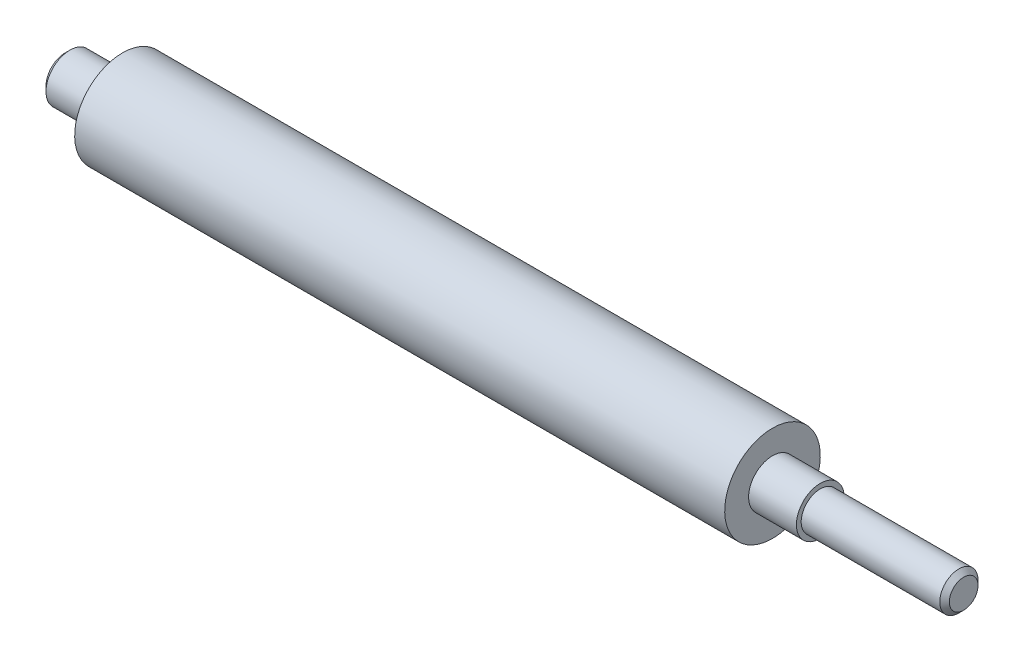
ISO-10303-21;
HEADER;
FILE_DESCRIPTION(('STEP AP214'),'2;1');
FILE_NAME('part.step','',(''),(''),'','','');
FILE_SCHEMA(('AUTOMOTIVE_DESIGN { 1 0 10303 214 1 1 1 1 }'));
ENDSEC;
DATA;
#1=APPLICATION_CONTEXT('core data for automotive mechanical design processes');
#2=APPLICATION_PROTOCOL_DEFINITION('international standard','automotive_design',2000,#1);
#3=PRODUCT_CONTEXT('',#1,'mechanical');
#4=PRODUCT('Part','Part','',(#3));
#5=PRODUCT_RELATED_PRODUCT_CATEGORY('part','',(#4));
#6=PRODUCT_DEFINITION_FORMATION('','',#4);
#7=PRODUCT_DEFINITION_CONTEXT('part definition',#1,'design');
#8=PRODUCT_DEFINITION('design','',#6,#7);
#9=PRODUCT_DEFINITION_SHAPE('','',#8);
#10=(LENGTH_UNIT() NAMED_UNIT(*) SI_UNIT(.MILLI.,.METRE.));
#11=(NAMED_UNIT(*) PLANE_ANGLE_UNIT() SI_UNIT($,.RADIAN.));
#12=(NAMED_UNIT(*) SI_UNIT($,.STERADIAN.) SOLID_ANGLE_UNIT());
#13=UNCERTAINTY_MEASURE_WITH_UNIT(LENGTH_MEASURE(1.E-05),#10,'distance_accuracy_value','');
#14=(GEOMETRIC_REPRESENTATION_CONTEXT(3) GLOBAL_UNCERTAINTY_ASSIGNED_CONTEXT((#13)) GLOBAL_UNIT_ASSIGNED_CONTEXT((#10,
#11,#12)) REPRESENTATION_CONTEXT('',''));
#15=CARTESIAN_POINT('',(0.,0.,0.));
#16=DIRECTION('',(0.,0.,1.));
#17=DIRECTION('',(1.,0.,0.));
#18=AXIS2_PLACEMENT_3D('',#15,#16,#17);
#19=CARTESIAN_POINT('',(0.,0.,0.));
#20=DIRECTION('',(-1.,0.,0.));
#21=DIRECTION('',(0.,-1.,0.));
#22=AXIS2_PLACEMENT_3D('',#19,#20,#21);
#23=PLANE('',#22);
#24=CARTESIAN_POINT('',(0.,0.,0.));
#25=DIRECTION('',(-1.,0.,0.));
#26=DIRECTION('',(0.,-1.,0.));
#27=AXIS2_PLACEMENT_3D('',#24,#25,#26);
#28=CIRCLE('',#27,2.);
#29=CARTESIAN_POINT('',(0.,-2.,0.));
#30=VERTEX_POINT('',#29);
#31=EDGE_CURVE('E10',#30,#30,#28,.T.);
#32=ORIENTED_EDGE('',*,*,#31,.T.);
#33=EDGE_LOOP('',(#32));
#34=FACE_BOUND('',#33,.T.);
#35=ADVANCED_FACE('F31',(#34),#23,.T.);
#36=CARTESIAN_POINT('',(94.,0.,0.));
#37=DIRECTION('',(1.,0.,0.));
#38=DIRECTION('',(0.,1.,0.));
#39=AXIS2_PLACEMENT_3D('',#36,#37,#38);
#40=CYLINDRICAL_SURFACE('',#39,2.49999999999998);
#41=CARTESIAN_POINT('',(0.499999999999987,0.,0.));
#42=DIRECTION('',(-1.,0.,0.));
#43=DIRECTION('',(0.,-1.,0.));
#44=AXIS2_PLACEMENT_3D('',#41,#42,#43);
#45=CIRCLE('',#44,2.49999999999998);
#46=CARTESIAN_POINT('',(0.499999999999987,-2.49999999999998,0.));
#47=VERTEX_POINT('',#46);
#48=EDGE_CURVE('E38',#47,#47,#45,.F.);
#49=ORIENTED_EDGE('',*,*,#48,.T.);
#50=EDGE_LOOP('',(#49));
#51=FACE_BOUND('',#50,.T.);
#52=CARTESIAN_POINT('',(6.00000000000001,0.,0.));
#53=DIRECTION('',(1.,0.,0.));
#54=DIRECTION('',(0.,1.,0.));
#55=AXIS2_PLACEMENT_3D('',#52,#53,#54);
#56=CIRCLE('',#55,2.49999999999998);
#57=CARTESIAN_POINT('',(6.00000000000001,2.49999999999998,0.));
#58=VERTEX_POINT('',#57);
#59=EDGE_CURVE('E51',#58,#58,#56,.T.);
#60=ORIENTED_EDGE('',*,*,#59,.F.);
#61=EDGE_LOOP('',(#60));
#62=FACE_BOUND('',#61,.T.);
#63=ADVANCED_FACE('F88',(#51,#62),#40,.T.);
#64=CARTESIAN_POINT('',(6.,2.49999999999998,0.));
#65=DIRECTION('',(-1.,0.,0.));
#66=DIRECTION('',(0.,-1.,0.));
#67=AXIS2_PLACEMENT_3D('',#64,#65,#66);
#68=PLANE('',#67);
#69=ORIENTED_EDGE('',*,*,#59,.T.);
#70=EDGE_LOOP('',(#69));
#71=FACE_BOUND('',#70,.T.);
#72=CARTESIAN_POINT('',(6.00000000000001,0.,0.));
#73=DIRECTION('',(1.,0.,0.));
#74=DIRECTION('',(0.,1.,0.));
#75=AXIS2_PLACEMENT_3D('',#72,#73,#74);
#76=CIRCLE('',#75,4.99999999999999);
#77=CARTESIAN_POINT('',(6.00000000000001,4.99999999999999,0.));
#78=VERTEX_POINT('',#77);
#79=EDGE_CURVE('E54',#78,#78,#76,.T.);
#80=ORIENTED_EDGE('',*,*,#79,.F.);
#81=EDGE_LOOP('',(#80));
#82=FACE_BOUND('',#81,.T.);
#83=ADVANCED_FACE('F93',(#71,#82),#68,.T.);
#84=CARTESIAN_POINT('',(94.,0.,0.));
#85=DIRECTION('',(1.,0.,0.));
#86=DIRECTION('',(0.,1.,0.));
#87=AXIS2_PLACEMENT_3D('',#84,#85,#86);
#88=CYLINDRICAL_SURFACE('',#87,4.99999999999999);
#89=ORIENTED_EDGE('',*,*,#79,.T.);
#90=EDGE_LOOP('',(#89));
#91=FACE_BOUND('',#90,.T.);
#92=CARTESIAN_POINT('',(74.,0.,0.));
#93=DIRECTION('',(1.,0.,0.));
#94=DIRECTION('',(0.,1.,0.));
#95=AXIS2_PLACEMENT_3D('',#92,#93,#94);
#96=CIRCLE('',#95,4.99999999999999);
#97=CARTESIAN_POINT('',(74.,4.99999999999999,0.));
#98=VERTEX_POINT('',#97);
#99=EDGE_CURVE('E57',#98,#98,#96,.T.);
#100=ORIENTED_EDGE('',*,*,#99,.F.);
#101=EDGE_LOOP('',(#100));
#102=FACE_BOUND('',#101,.T.);
#103=ADVANCED_FACE('F146',(#91,#102),#88,.T.);
#104=CARTESIAN_POINT('',(74.,4.99999999999999,0.));
#105=DIRECTION('',(1.,0.,0.));
#106=DIRECTION('',(0.,1.,0.));
#107=AXIS2_PLACEMENT_3D('',#104,#105,#106);
#108=PLANE('',#107);
#109=ORIENTED_EDGE('',*,*,#99,.T.);
#110=EDGE_LOOP('',(#109));
#111=FACE_BOUND('',#110,.T.);
#112=CARTESIAN_POINT('',(74.,0.,0.));
#113=DIRECTION('',(1.,0.,0.));
#114=DIRECTION('',(0.,1.,0.));
#115=AXIS2_PLACEMENT_3D('',#112,#113,#114);
#116=CIRCLE('',#115,2.49999999999999);
#117=CARTESIAN_POINT('',(74.,2.49999999999999,0.));
#118=VERTEX_POINT('',#117);
#119=EDGE_CURVE('E60',#118,#118,#116,.T.);
#120=ORIENTED_EDGE('',*,*,#119,.F.);
#121=EDGE_LOOP('',(#120));
#122=FACE_BOUND('',#121,.T.);
#123=ADVANCED_FACE('F84',(#111,#122),#108,.T.);
#124=CARTESIAN_POINT('',(94.,0.,0.));
#125=DIRECTION('',(1.,0.,0.));
#126=DIRECTION('',(0.,1.,0.));
#127=AXIS2_PLACEMENT_3D('',#124,#125,#126);
#128=CYLINDRICAL_SURFACE('',#127,2.49999999999999);
#129=ORIENTED_EDGE('',*,*,#119,.T.);
#130=EDGE_LOOP('',(#129));
#131=FACE_BOUND('',#130,.T.);
#132=CARTESIAN_POINT('',(79.,0.,0.));
#133=DIRECTION('',(1.,0.,0.));
#134=DIRECTION('',(0.,1.,0.));
#135=AXIS2_PLACEMENT_3D('',#132,#133,#134);
#136=CIRCLE('',#135,2.49999999999999);
#137=CARTESIAN_POINT('',(79.,2.49999999999999,0.));
#138=VERTEX_POINT('',#137);
#139=EDGE_CURVE('E63',#138,#138,#136,.T.);
#140=ORIENTED_EDGE('',*,*,#139,.F.);
#141=EDGE_LOOP('',(#140));
#142=FACE_BOUND('',#141,.T.);
#143=ADVANCED_FACE('F74',(#131,#142),#128,.T.);
#144=CARTESIAN_POINT('',(79.,2.49999999999999,0.));
#145=DIRECTION('',(1.,0.,0.));
#146=DIRECTION('',(0.,1.,0.));
#147=AXIS2_PLACEMENT_3D('',#144,#145,#146);
#148=PLANE('',#147);
#149=ORIENTED_EDGE('',*,*,#139,.T.);
#150=EDGE_LOOP('',(#149));
#151=FACE_BOUND('',#150,.T.);
#152=CARTESIAN_POINT('',(79.,0.,0.));
#153=DIRECTION('',(1.,0.,0.));
#154=DIRECTION('',(0.,1.,0.));
#155=AXIS2_PLACEMENT_3D('',#152,#153,#154);
#156=CIRCLE('',#155,2.);
#157=CARTESIAN_POINT('',(79.,2.,0.));
#158=VERTEX_POINT('',#157);
#159=EDGE_CURVE('E66',#158,#158,#156,.T.);
#160=ORIENTED_EDGE('',*,*,#159,.F.);
#161=EDGE_LOOP('',(#160));
#162=FACE_BOUND('',#161,.T.);
#163=ADVANCED_FACE('F72',(#151,#162),#148,.T.);
#164=CARTESIAN_POINT('',(94.,0.,0.));
#165=DIRECTION('',(1.,0.,0.));
#166=DIRECTION('',(0.,1.,0.));
#167=AXIS2_PLACEMENT_3D('',#164,#165,#166);
#168=CYLINDRICAL_SURFACE('',#167,2.);
#169=CARTESIAN_POINT('',(93.5,0.,0.));
#170=DIRECTION('',(1.,0.,0.));
#171=DIRECTION('',(0.,1.,0.));
#172=AXIS2_PLACEMENT_3D('',#169,#170,#171);
#173=CIRCLE('',#172,2.);
#174=CARTESIAN_POINT('',(93.5,2.,0.));
#175=VERTEX_POINT('',#174);
#176=EDGE_CURVE('E42',#175,#175,#173,.F.);
#177=ORIENTED_EDGE('',*,*,#176,.T.);
#178=EDGE_LOOP('',(#177));
#179=FACE_BOUND('',#178,.T.);
#180=ORIENTED_EDGE('',*,*,#159,.T.);
#181=EDGE_LOOP('',(#180));
#182=FACE_BOUND('',#181,.T.);
#183=ADVANCED_FACE('F70',(#179,#182),#168,.T.);
#184=CARTESIAN_POINT('',(94.,2.,0.));
#185=DIRECTION('',(1.,0.,0.));
#186=DIRECTION('',(0.,1.,0.));
#187=AXIS2_PLACEMENT_3D('',#184,#185,#186);
#188=PLANE('',#187);
#189=CARTESIAN_POINT('',(94.,0.,0.));
#190=DIRECTION('',(1.,0.,0.));
#191=DIRECTION('',(0.,1.,0.));
#192=AXIS2_PLACEMENT_3D('',#189,#190,#191);
#193=CIRCLE('',#192,1.49999999999999);
#194=CARTESIAN_POINT('',(94.,1.49999999999999,0.));
#195=VERTEX_POINT('',#194);
#196=EDGE_CURVE('E46',#195,#195,#193,.T.);
#197=ORIENTED_EDGE('',*,*,#196,.T.);
#198=EDGE_LOOP('',(#197));
#199=FACE_BOUND('',#198,.T.);
#200=ADVANCED_FACE('F81',(#199),#188,.T.);
#201=CARTESIAN_POINT('',(94.,0.,0.));
#202=DIRECTION('',(-1.,0.,0.));
#203=DIRECTION('',(0.,-1.,0.));
#204=AXIS2_PLACEMENT_3D('',#201,#202,#203);
#205=CONICAL_SURFACE('',#204,1.49999999999999,0.785398163397445);
#206=ORIENTED_EDGE('',*,*,#176,.F.);
#207=EDGE_LOOP('',(#206));
#208=FACE_BOUND('',#207,.T.);
#209=ORIENTED_EDGE('',*,*,#196,.F.);
#210=EDGE_LOOP('',(#209));
#211=FACE_BOUND('',#210,.T.);
#212=ADVANCED_FACE('F96',(#208,#211),#205,.T.);
#213=CARTESIAN_POINT('',(0.499999999999987,0.,0.));
#214=DIRECTION('',(1.,0.,0.));
#215=DIRECTION('',(0.,1.,0.));
#216=AXIS2_PLACEMENT_3D('',#213,#214,#215);
#217=CONICAL_SURFACE('',#216,2.49999999999998,0.785398163397444);
#218=ORIENTED_EDGE('',*,*,#31,.F.);
#219=EDGE_LOOP('',(#218));
#220=FACE_BOUND('',#219,.T.);
#221=ORIENTED_EDGE('',*,*,#48,.F.);
#222=EDGE_LOOP('',(#221));
#223=FACE_BOUND('',#222,.T.);
#224=ADVANCED_FACE('F33',(#220,#223),#217,.T.);
#225=CLOSED_SHELL('',(#35,#63,#83,#103,#123,#143,#163,#183,#200,#212,#224));
#226=MANIFOLD_SOLID_BREP('B2',#225);
#227=ADVANCED_BREP_SHAPE_REPRESENTATION('',(#18,#226),#14);
#228=SHAPE_DEFINITION_REPRESENTATION(#9,#227);
ENDSEC;
END-ISO-10303-21;
